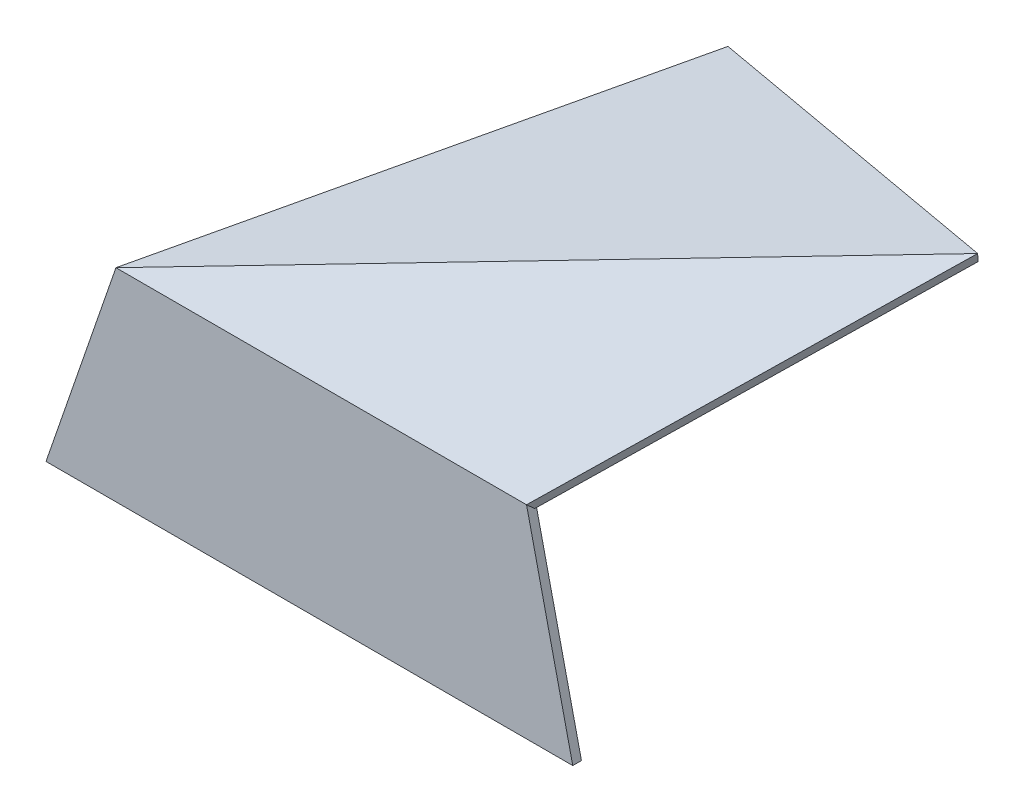
ISO-10303-21;
HEADER;
FILE_DESCRIPTION(('STEP AP214'),'2;1');
FILE_NAME('part.step','',(''),(''),'','','');
FILE_SCHEMA(('AUTOMOTIVE_DESIGN { 1 0 10303 214 1 1 1 1 }'));
ENDSEC;
DATA;
#1=APPLICATION_CONTEXT('core data for automotive mechanical design processes');
#2=APPLICATION_PROTOCOL_DEFINITION('international standard','automotive_design',2000,#1);
#3=PRODUCT_CONTEXT('',#1,'mechanical');
#4=PRODUCT('Part','Part','',(#3));
#5=PRODUCT_RELATED_PRODUCT_CATEGORY('part','',(#4));
#6=PRODUCT_DEFINITION_FORMATION('','',#4);
#7=PRODUCT_DEFINITION_CONTEXT('part definition',#1,'design');
#8=PRODUCT_DEFINITION('design','',#6,#7);
#9=PRODUCT_DEFINITION_SHAPE('','',#8);
#10=(LENGTH_UNIT() NAMED_UNIT(*) SI_UNIT(.MILLI.,.METRE.));
#11=(NAMED_UNIT(*) PLANE_ANGLE_UNIT() SI_UNIT($,.RADIAN.));
#12=(NAMED_UNIT(*) SI_UNIT($,.STERADIAN.) SOLID_ANGLE_UNIT());
#13=UNCERTAINTY_MEASURE_WITH_UNIT(LENGTH_MEASURE(1.E-05),#10,'distance_accuracy_value','');
#14=(GEOMETRIC_REPRESENTATION_CONTEXT(3) GLOBAL_UNCERTAINTY_ASSIGNED_CONTEXT((#13)) GLOBAL_UNIT_ASSIGNED_CONTEXT((#10,
#11,#12)) REPRESENTATION_CONTEXT('',''));
#15=CARTESIAN_POINT('',(0.,0.,0.));
#16=DIRECTION('',(0.,0.,1.));
#17=DIRECTION('',(1.,0.,0.));
#18=AXIS2_PLACEMENT_3D('',#15,#16,#17);
#19=CARTESIAN_POINT('',(-65.6264099177143,117.102491510293,-90.2235094552557));
#20=DIRECTION('',(0.304252955421805,0.159142233524788,-0.939203858928315));
#21=DIRECTION('',(0.951327899685778,0.,0.308180510868949));
#22=AXIS2_PLACEMENT_3D('',#19,#20,#21);
#23=PLANE('',#22);
#24=DIRECTION('',(-0.187929804053522,-0.956541421497746,-0.22295940820579));
#25=VECTOR('',#24,1.);
#26=CARTESIAN_POINT('',(-66.8671140894064,117.427113069988,-90.5704276539875));
#27=LINE('',#26,#25);
#28=CARTESIAN_POINT('',(-66.3616240753388,120.,-89.9707156766457));
#29=VERTEX_POINT('',#28);
#30=CARTESIAN_POINT('',(-66.9904366975838,116.799414959394,-90.7167372607904));
#31=VERTEX_POINT('',#30);
#32=EDGE_CURVE('E147',#29,#31,#27,.T.);
#33=ORIENTED_EDGE('',*,*,#32,.T.);
#34=DIRECTION('',(0.920527107119874,0.204534239908418,0.33285971483885));
#35=VECTOR('',#34,1.);
#36=CARTESIAN_POINT('',(-65.6264099177143,117.102491510293,-90.2235094552557));
#37=LINE('',#36,#35);
#38=CARTESIAN_POINT('',(-197.256752773698,87.8552136010427,-137.820628593082));
#39=VERTEX_POINT('',#38);
#40=EDGE_CURVE('E150',#39,#31,#37,.T.);
#41=ORIENTED_EDGE('',*,*,#40,.F.);
#42=DIRECTION('',(0.86834425694282,-0.451722228460799,0.204756635420762));
#43=VECTOR('',#42,1.);
#44=CARTESIAN_POINT('',(-101.014136019811,37.7887463383621,-115.126502118409));
#45=LINE('',#44,#43);
#46=CARTESIAN_POINT('',(-201.379669102721,90.,-138.792817294627));
#47=VERTEX_POINT('',#46);
#48=EDGE_CURVE('E149',#47,#39,#45,.T.);
#49=ORIENTED_EDGE('',*,*,#48,.F.);
#50=DIRECTION('',(0.920527107119874,0.204534239908418,0.33285971483885));
#51=VECTOR('',#50,1.);
#52=CARTESIAN_POINT('',(-66.3616240753388,120.,-89.9707156766455));
#53=LINE('',#52,#51);
#54=EDGE_CURVE('E128',#47,#29,#53,.T.);
#55=ORIENTED_EDGE('',*,*,#54,.T.);
#56=EDGE_LOOP('',(#33,#41,#49,#55));
#57=FACE_BOUND('',#56,.T.);
#58=ADVANCED_FACE('F37',(#57),#23,.T.);
#59=CARTESIAN_POINT('',(-29.7963498763621,117.428610199771,10.2450854569714));
#60=DIRECTION('',(0.245071385874835,-0.965836163235684,-0.0842645928700795));
#61=DIRECTION('',(0.969283502844479,0.245946114247687,0.));
#62=AXIS2_PLACEMENT_3D('',#59,#60,#61);
#63=PLANE('',#62);
#64=DIRECTION('',(-0.470069195053946,-0.194389831488703,0.860957342308624));
#65=VECTOR('',#64,1.);
#66=CARTESIAN_POINT('',(-99.5745610483965,103.324755253104,-31.0371381768513));
#67=LINE('',#66,#65);
#68=CARTESIAN_POINT('',(-67.1355826439961,116.739392102416,-90.4508945517064));
#69=VERTEX_POINT('',#68);
#70=EDGE_CURVE('E155',#31,#69,#67,.T.);
#71=ORIENTED_EDGE('',*,*,#70,.T.);
#72=DIRECTION('',(-0.879504197030551,-0.258050740898938,0.399852701037714));
#73=VECTOR('',#72,1.);
#74=CARTESIAN_POINT('',(-73.5082012936306,114.869635289934,-87.5536840684105));
#75=LINE('',#74,#73);
#76=CARTESIAN_POINT('',(-266.088700071832,58.3655952180526,0.));
#77=VERTEX_POINT('',#76);
#78=EDGE_CURVE('E177',#69,#77,#75,.T.);
#79=ORIENTED_EDGE('',*,*,#78,.T.);
#80=DIRECTION('',(0.969283502844479,0.245946114247687,0.));
#81=VECTOR('',#80,1.);
#82=CARTESIAN_POINT('',(-30.0094325003818,118.268377369246,0.));
#83=LINE('',#82,#81);
#84=CARTESIAN_POINT('',(-267.396418613394,58.0337745557975,0.));
#85=VERTEX_POINT('',#84);
#86=EDGE_CURVE('E175',#85,#77,#83,.T.);
#87=ORIENTED_EDGE('',*,*,#86,.F.);
#88=DIRECTION('',(-0.432277784470545,-0.186654895628153,0.882210783765014));
#89=VECTOR('',#88,1.);
#90=CARTESIAN_POINT('',(-222.112189580669,77.5872268666936,-92.4179696999367));
#91=LINE('',#90,#89);
#92=CARTESIAN_POINT('',(-200.251025513292,87.0267434088264,-137.033157846878));
#93=VERTEX_POINT('',#92);
#94=EDGE_CURVE('E171',#93,#85,#91,.T.);
#95=ORIENTED_EDGE('',*,*,#94,.F.);
#96=DIRECTION('',(-0.934245131699553,-0.258491564112286,0.245699298286478));
#97=VECTOR('',#96,1.);
#98=CARTESIAN_POINT('',(-77.9406656346402,120.868178766005,-169.199843629529));
#99=LINE('',#98,#97);
#100=EDGE_CURVE('E157',#39,#93,#99,.T.);
#101=ORIENTED_EDGE('',*,*,#100,.F.);
#102=ORIENTED_EDGE('',*,*,#40,.T.);
#103=EDGE_LOOP('',(#71,#79,#87,#95,#101,#102));
#104=FACE_BOUND('',#103,.T.);
#105=ADVANCED_FACE('F218',(#104),#63,.T.);
#106=CARTESIAN_POINT('',(-270.857265661192,60.0000000000001,3.));
#107=DIRECTION('',(-0.945352988391982,0.326048657930604,0.));
#108=DIRECTION('',(-0.326048657930604,-0.945352988391983,0.));
#109=AXIS2_PLACEMENT_3D('',#106,#107,#108);
#110=PLANE('',#109);
#111=DIRECTION('',(0.,0.,-1.));
#112=VECTOR('',#111,1.);
#113=CARTESIAN_POINT('',(-294.999999999996,-10.,3.));
#114=LINE('',#113,#112);
#115=CARTESIAN_POINT('',(-294.999999999996,-10.,3.));
#116=VERTEX_POINT('',#115);
#117=CARTESIAN_POINT('',(-294.999999999996,-9.99999999999999,-67.7927644252726));
#118=VERTEX_POINT('',#117);
#119=EDGE_CURVE('E200',#116,#118,#114,.T.);
#120=ORIENTED_EDGE('',*,*,#119,.F.);
#121=DIRECTION('',(-0.326048657930604,-0.945352988391983,0.));
#122=VECTOR('',#121,1.);
#123=CARTESIAN_POINT('',(-270.857265661192,60.0000000000001,3.));
#124=LINE('',#123,#122);
#125=CARTESIAN_POINT('',(-270.857265661192,60.0000000000001,3.));
#126=VERTEX_POINT('',#125);
#127=EDGE_CURVE('E193',#126,#116,#124,.T.);
#128=ORIENTED_EDGE('',*,*,#127,.F.);
#129=DIRECTION('',(0.235670838047757,0.683309455831923,0.691048076232435));
#130=VECTOR('',#129,1.);
#131=CARTESIAN_POINT('',(-270.857265661192,60.0000000000006,2.99999999999943));
#132=LINE('',#131,#130);
#133=EDGE_CURVE('E151',#118,#126,#132,.T.);
#134=ORIENTED_EDGE('',*,*,#133,.F.);
#135=EDGE_LOOP('',(#120,#128,#134));
#136=FACE_BOUND('',#135,.T.);
#137=ADVANCED_FACE('F39',(#136),#110,.T.);
#138=CARTESIAN_POINT('',(-113.158578493739,-10.,3.));
#139=DIRECTION('',(0.974977660972466,0.22230285784186,0.));
#140=DIRECTION('',(-0.22230285784186,0.974977660972467,0.));
#141=AXIS2_PLACEMENT_3D('',#138,#139,#140);
#142=PLANE('',#141);
#143=DIRECTION('',(-0.149857232448717,0.657245054746863,0.738628288040476));
#144=VECTOR('',#143,1.);
#145=CARTESIAN_POINT('',(-121.866215037482,28.1900223525523,-32.7488415662397));
#146=LINE('',#145,#144);
#147=CARTESIAN_POINT('',(-128.647281417972,57.9304777957866,0.674219635857589));
#148=VERTEX_POINT('',#147);
#149=CARTESIAN_POINT('',(-129.119149357905,60.0000000000001,3.00000000000001));
#150=VERTEX_POINT('',#149);
#151=EDGE_CURVE('E11',#148,#150,#146,.T.);
#152=ORIENTED_EDGE('',*,*,#151,.T.);
#153=DIRECTION('',(-0.22230285784186,0.974977660972466,0.));
#154=VECTOR('',#153,1.);
#155=CARTESIAN_POINT('',(-113.158578493739,-10.,3.));
#156=LINE('',#155,#154);
#157=CARTESIAN_POINT('',(-113.158578493739,-10.,3.));
#158=VERTEX_POINT('',#157);
#159=EDGE_CURVE('E197',#158,#150,#156,.T.);
#160=ORIENTED_EDGE('',*,*,#159,.F.);
#161=DIRECTION('',(0.,0.,-1.));
#162=VECTOR('',#161,1.);
#163=CARTESIAN_POINT('',(-113.158578493739,-10.,3.));
#164=LINE('',#163,#162);
#165=CARTESIAN_POINT('',(-113.158578493739,-10.,0.));
#166=VERTEX_POINT('',#165);
#167=EDGE_CURVE('E204',#158,#166,#164,.T.);
#168=ORIENTED_EDGE('',*,*,#167,.T.);
#169=DIRECTION('',(-0.22230285784186,0.974977660972466,0.));
#170=VECTOR('',#169,1.);
#171=CARTESIAN_POINT('',(-113.158578493739,-10.,0.));
#172=LINE('',#171,#170);
#173=CARTESIAN_POINT('',(-128.746491738719,58.3655952180526,0.));
#174=VERTEX_POINT('',#173);
#175=EDGE_CURVE('E195',#166,#174,#172,.T.);
#176=ORIENTED_EDGE('',*,*,#175,.T.);
#177=DIRECTION('',(-0.122702572491662,0.538149928816156,-0.833869733722897));
#178=VECTOR('',#177,1.);
#179=CARTESIAN_POINT('',(-123.690504452445,36.1910055338091,34.3597912130013));
#180=LINE('',#179,#178);
#181=EDGE_CURVE('E188',#148,#174,#180,.T.);
#182=ORIENTED_EDGE('',*,*,#181,.F.);
#183=EDGE_LOOP('',(#152,#160,#168,#176,#182));
#184=FACE_BOUND('',#183,.T.);
#185=ADVANCED_FACE('F230',(#184),#142,.T.);
#186=CARTESIAN_POINT('',(-294.999999999996,-10.,3.));
#187=DIRECTION('',(0.,-1.,0.));
#188=DIRECTION('',(0.,0.,1.));
#189=AXIS2_PLACEMENT_3D('',#186,#187,#188);
#190=PLANE('',#189);
#191=DIRECTION('',(1.,0.,0.));
#192=VECTOR('',#191,1.);
#193=CARTESIAN_POINT('',(-294.999999999996,-10.,3.));
#194=LINE('',#193,#192);
#195=EDGE_CURVE('E61',#116,#158,#194,.T.);
#196=ORIENTED_EDGE('',*,*,#195,.F.);
#197=ORIENTED_EDGE('',*,*,#119,.T.);
#198=DIRECTION('',(-0.995991357431729,0.,0.0894495160484497));
#199=VECTOR('',#198,1.);
#200=CARTESIAN_POINT('',(-292.717920357772,-10.,-67.9977169261732));
#201=LINE('',#200,#199);
#202=CARTESIAN_POINT('',(-291.087783751485,-10.,-68.1441187291981));
#203=VERTEX_POINT('',#202);
#204=EDGE_CURVE('E163',#203,#118,#201,.T.);
#205=ORIENTED_EDGE('',*,*,#204,.F.);
#206=DIRECTION('',(0.324883892594821,0.,-0.945753908970212));
#207=VECTOR('',#206,1.);
#208=CARTESIAN_POINT('',(-281.301577334556,-10.,-96.6322746019885));
#209=LINE('',#208,#207);
#210=CARTESIAN_POINT('',(-291.82658220068,-10.,-65.9934380177403));
#211=VERTEX_POINT('',#210);
#212=EDGE_CURVE('E165',#211,#203,#209,.T.);
#213=ORIENTED_EDGE('',*,*,#212,.F.);
#214=DIRECTION('',(0.,0.,1.));
#215=VECTOR('',#214,1.);
#216=CARTESIAN_POINT('',(-291.82658220068,-9.99999999999999,0.));
#217=LINE('',#216,#215);
#218=CARTESIAN_POINT('',(-291.82658220068,-9.99999999999999,0.));
#219=VERTEX_POINT('',#218);
#220=EDGE_CURVE('E167',#211,#219,#217,.T.);
#221=ORIENTED_EDGE('',*,*,#220,.T.);
#222=DIRECTION('',(1.,0.,0.));
#223=VECTOR('',#222,1.);
#224=CARTESIAN_POINT('',(-294.999999999996,-10.,0.));
#225=LINE('',#224,#223);
#226=EDGE_CURVE('E71',#219,#166,#225,.T.);
#227=ORIENTED_EDGE('',*,*,#226,.T.);
#228=ORIENTED_EDGE('',*,*,#167,.F.);
#229=EDGE_LOOP('',(#196,#197,#205,#213,#221,#227,#228));
#230=FACE_BOUND('',#229,.T.);
#231=ADVANCED_FACE('F233',(#230),#190,.T.);
#232=CARTESIAN_POINT('',(0.,0.,3.));
#233=DIRECTION('',(0.,0.,-1.));
#234=DIRECTION('',(1.,0.,0.));
#235=AXIS2_PLACEMENT_3D('',#232,#233,#234);
#236=PLANE('',#235);
#237=ORIENTED_EDGE('',*,*,#127,.T.);
#238=ORIENTED_EDGE('',*,*,#195,.T.);
#239=ORIENTED_EDGE('',*,*,#159,.T.);
#240=DIRECTION('',(-1.,0.,0.));
#241=VECTOR('',#240,1.);
#242=CARTESIAN_POINT('',(-129.119149357905,60.,3.));
#243=LINE('',#242,#241);
#244=EDGE_CURVE('E138',#150,#126,#243,.T.);
#245=ORIENTED_EDGE('',*,*,#244,.T.);
#246=EDGE_LOOP('',(#237,#238,#239,#245));
#247=FACE_BOUND('',#246,.T.);
#248=ADVANCED_FACE('F227',(#247),#236,.F.);
#249=CARTESIAN_POINT('',(0.,0.,0.));
#250=DIRECTION('',(0.,0.,-1.));
#251=DIRECTION('',(1.,0.,0.));
#252=AXIS2_PLACEMENT_3D('',#249,#250,#251);
#253=PLANE('',#252);
#254=ORIENTED_EDGE('',*,*,#86,.T.);
#255=DIRECTION('',(-1.,0.,0.));
#256=VECTOR('',#255,1.);
#257=CARTESIAN_POINT('',(0.,58.3655952180526,0.));
#258=LINE('',#257,#256);
#259=EDGE_CURVE('E45',#174,#77,#258,.T.);
#260=ORIENTED_EDGE('',*,*,#259,.F.);
#261=ORIENTED_EDGE('',*,*,#175,.F.);
#262=ORIENTED_EDGE('',*,*,#226,.F.);
#263=DIRECTION('',(-0.326048657930604,-0.945352988391983,0.));
#264=VECTOR('',#263,1.);
#265=CARTESIAN_POINT('',(-268.021206696016,59.0218540262082,0.));
#266=LINE('',#265,#264);
#267=CARTESIAN_POINT('',(-269.320580985705,55.254418283356,0.));
#268=VERTEX_POINT('',#267);
#269=EDGE_CURVE('E191',#268,#219,#266,.T.);
#270=ORIENTED_EDGE('',*,*,#269,.F.);
#271=DIRECTION('',(0.569208508058263,0.822193209868633,0.));
#272=VECTOR('',#271,1.);
#273=CARTESIAN_POINT('',(-207.920196648634,143.944201325208,0.));
#274=LINE('',#273,#272);
#275=EDGE_CURVE('E182',#268,#85,#274,.T.);
#276=ORIENTED_EDGE('',*,*,#275,.T.);
#277=EDGE_LOOP('',(#254,#260,#261,#262,#270,#276));
#278=FACE_BOUND('',#277,.T.);
#279=ADVANCED_FACE('F213',(#278),#253,.T.);
#280=CARTESIAN_POINT('',(-257.720850738649,88.8869433279116,0.));
#281=DIRECTION('',(-0.945352988391983,0.326048657930604,0.));
#282=DIRECTION('',(-0.326048657930604,-0.945352988391983,0.));
#283=AXIS2_PLACEMENT_3D('',#280,#281,#282);
#284=PLANE('',#283);
#285=DIRECTION('',(-0.235670838047757,-0.683309455831923,-0.691048076232435));
#286=VECTOR('',#285,1.);
#287=CARTESIAN_POINT('',(-263.260272265329,72.8258169689001,17.7703983966896));
#288=LINE('',#287,#286);
#289=EDGE_CURVE('E135',#268,#211,#288,.T.);
#290=ORIENTED_EDGE('',*,*,#289,.F.);
#291=ORIENTED_EDGE('',*,*,#269,.T.);
#292=ORIENTED_EDGE('',*,*,#220,.F.);
#293=EDGE_LOOP('',(#290,#291,#292));
#294=FACE_BOUND('',#293,.T.);
#295=ADVANCED_FACE('F235',(#294),#284,.F.);
#296=CARTESIAN_POINT('',(-66.3616240753389,117.479343429533,-91.5974579591727));
#297=DIRECTION('',(0.869834910030554,-0.267513925170954,0.414516017943537));
#298=DIRECTION('',(-0.430194903883075,0.,0.902736032665713));
#299=AXIS2_PLACEMENT_3D('',#296,#297,#298);
#300=PLANE('',#299);
#301=DIRECTION('',(-0.49334291247786,-0.471665742321656,0.73085169373001));
#302=VECTOR('',#301,1.);
#303=CARTESIAN_POINT('',(-66.3616240753389,117.479343429533,-91.5974579591727));
#304=LINE('',#303,#302);
#305=EDGE_CURVE('E142',#69,#148,#304,.T.);
#306=ORIENTED_EDGE('',*,*,#305,.F.);
#307=ORIENTED_EDGE('',*,*,#70,.F.);
#308=ORIENTED_EDGE('',*,*,#32,.F.);
#309=DIRECTION('',(-0.49334291247786,-0.471665742321656,0.73085169373001));
#310=VECTOR('',#309,1.);
#311=CARTESIAN_POINT('',(-66.3616240753389,120.,-89.9707156766455));
#312=LINE('',#311,#310);
#313=EDGE_CURVE('E134',#29,#150,#312,.T.);
#314=ORIENTED_EDGE('',*,*,#313,.T.);
#315=ORIENTED_EDGE('',*,*,#151,.F.);
#316=EDGE_LOOP('',(#306,#307,#308,#314,#315));
#317=FACE_BOUND('',#316,.T.);
#318=ADVANCED_FACE('F153',(#317),#300,.T.);
#319=CARTESIAN_POINT('',(0.,41.2042266120901,26.5917453547842));
#320=DIRECTION('',(0.,0.840218856822311,0.542247427509075));
#321=DIRECTION('',(0.,0.542247427509075,-0.840218856822311));
#322=AXIS2_PLACEMENT_3D('',#319,#320,#321);
#323=PLANE('',#322);
#324=ORIENTED_EDGE('',*,*,#305,.T.);
#325=ORIENTED_EDGE('',*,*,#181,.T.);
#326=ORIENTED_EDGE('',*,*,#259,.T.);
#327=ORIENTED_EDGE('',*,*,#78,.F.);
#328=EDGE_LOOP('',(#324,#325,#326,#327));
#329=FACE_BOUND('',#328,.T.);
#330=ADVANCED_FACE('F210',(#329),#323,.F.);
#331=CARTESIAN_POINT('',(0.,43.724883182557,28.2184876373115));
#332=DIRECTION('',(0.,0.840218856822311,0.542247427509075));
#333=DIRECTION('',(0.,0.542247427509075,-0.840218856822311));
#334=AXIS2_PLACEMENT_3D('',#331,#332,#333);
#335=PLANE('',#334);
#336=DIRECTION('',(0.879504197030551,0.258050740898938,-0.399852701037714));
#337=VECTOR('',#336,1.);
#338=CARTESIAN_POINT('',(-270.857265661192,60.0000000000001,3.));
#339=LINE('',#338,#337);
#340=EDGE_CURVE('E124',#126,#29,#339,.T.);
#341=ORIENTED_EDGE('',*,*,#340,.F.);
#342=ORIENTED_EDGE('',*,*,#244,.F.);
#343=ORIENTED_EDGE('',*,*,#313,.F.);
#344=EDGE_LOOP('',(#341,#342,#343));
#345=FACE_BOUND('',#344,.T.);
#346=ADVANCED_FACE('F137',(#345),#335,.T.);
#347=CARTESIAN_POINT('',(-192.559438460714,133.309870919845,-66.1477148861143));
#348=DIRECTION('',(0.791239486782543,-0.547779089370293,0.271805341751686));
#349=DIRECTION('',(0.569208508058263,0.822193209868633,0.));
#350=AXIS2_PLACEMENT_3D('',#347,#348,#349);
#351=PLANE('',#350);
#352=ORIENTED_EDGE('',*,*,#212,.T.);
#353=DIRECTION('',(0.606776873500826,0.648125110951179,-0.460169171434901));
#354=VECTOR('',#353,1.);
#355=CARTESIAN_POINT('',(-292.626281539649,-11.6433372681109,-66.9773484000176));
#356=LINE('',#355,#354);
#357=EDGE_CURVE('E52',#203,#93,#356,.T.);
#358=ORIENTED_EDGE('',*,*,#357,.T.);
#359=ORIENTED_EDGE('',*,*,#94,.T.);
#360=ORIENTED_EDGE('',*,*,#275,.F.);
#361=ORIENTED_EDGE('',*,*,#289,.T.);
#362=EDGE_LOOP('',(#352,#358,#359,#360,#361));
#363=FACE_BOUND('',#362,.T.);
#364=ADVANCED_FACE('F237',(#363),#351,.T.);
#365=CARTESIAN_POINT('',(-292.626281539649,-11.6433372681109,-66.9773484000176));
#366=DIRECTION('',(-0.0759071824049579,-0.529029214508211,-0.845201863377126));
#367=DIRECTION('',(0.,-0.847647421213913,0.530559939412508));
#368=AXIS2_PLACEMENT_3D('',#365,#366,#367);
#369=PLANE('',#368);
#370=ORIENTED_EDGE('',*,*,#48,.T.);
#371=ORIENTED_EDGE('',*,*,#100,.T.);
#372=ORIENTED_EDGE('',*,*,#357,.F.);
#373=ORIENTED_EDGE('',*,*,#204,.T.);
#374=DIRECTION('',(0.606776873500826,0.648125110951179,-0.460169171434901));
#375=VECTOR('',#374,1.);
#376=CARTESIAN_POINT('',(-294.999999999996,-9.99999999999998,-67.7927644252726));
#377=LINE('',#376,#375);
#378=EDGE_CURVE('E180',#118,#47,#377,.T.);
#379=ORIENTED_EDGE('',*,*,#378,.T.);
#380=EDGE_LOOP('',(#370,#371,#372,#373,#379));
#381=FACE_BOUND('',#380,.T.);
#382=ADVANCED_FACE('F219',(#381),#369,.T.);
#383=CARTESIAN_POINT('',(-194.933156921062,134.953208187955,-66.9631309113693));
#384=DIRECTION('',(0.791239486782543,-0.547779089370293,0.271805341751686));
#385=DIRECTION('',(0.569208508058263,0.822193209868633,0.));
#386=AXIS2_PLACEMENT_3D('',#383,#384,#385);
#387=PLANE('',#386);
#388=DIRECTION('',(-0.432277784470545,-0.186654895628153,0.882210783765014));
#389=VECTOR('',#388,1.);
#390=CARTESIAN_POINT('',(-201.379669102721,90.0000000000001,-138.792817294627));
#391=LINE('',#390,#389);
#392=EDGE_CURVE('E130',#47,#126,#391,.T.);
#393=ORIENTED_EDGE('',*,*,#392,.F.);
#394=ORIENTED_EDGE('',*,*,#378,.F.);
#395=ORIENTED_EDGE('',*,*,#133,.T.);
#396=EDGE_LOOP('',(#393,#394,#395));
#397=FACE_BOUND('',#396,.T.);
#398=ADVANCED_FACE('F223',(#397),#387,.F.);
#399=CARTESIAN_POINT('',(-30.5315640339866,120.326118689478,10.4978792355816));
#400=DIRECTION('',(0.245071385874835,-0.965836163235684,-0.0842645928700795));
#401=DIRECTION('',(0.969283502844479,0.245946114247687,0.));
#402=AXIS2_PLACEMENT_3D('',#399,#400,#401);
#403=PLANE('',#402);
#404=ORIENTED_EDGE('',*,*,#340,.T.);
#405=ORIENTED_EDGE('',*,*,#54,.F.);
#406=ORIENTED_EDGE('',*,*,#392,.T.);
#407=EDGE_LOOP('',(#404,#405,#406));
#408=FACE_BOUND('',#407,.T.);
#409=ADVANCED_FACE('F126',(#408),#403,.F.);
#410=CLOSED_SHELL('',(#58,#105,#137,#185,#231,#248,#279,#295,#318,#330,#346,#364,#382,#398,#409));
#411=MANIFOLD_SOLID_BREP('B2',#410);
#412=ADVANCED_BREP_SHAPE_REPRESENTATION('',(#18,#411),#14);
#413=SHAPE_DEFINITION_REPRESENTATION(#9,#412);
ENDSEC;
END-ISO-10303-21;
